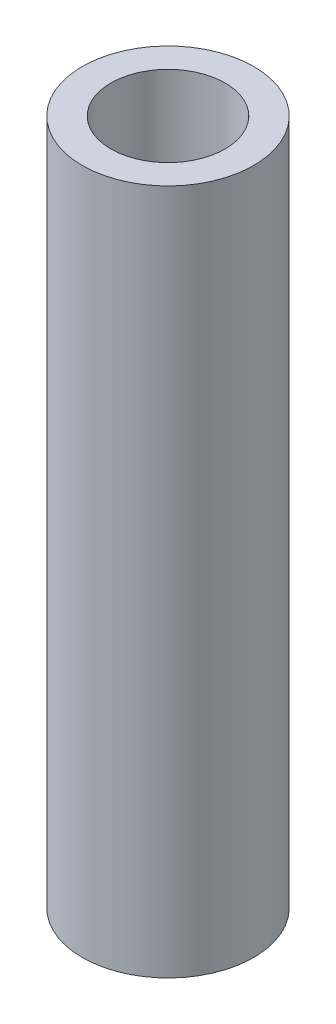
ISO-10303-21;
HEADER;
FILE_DESCRIPTION(('STEP AP214'),'2;1');
FILE_NAME('part.step','',(''),(''),'','','');
FILE_SCHEMA(('AUTOMOTIVE_DESIGN { 1 0 10303 214 1 1 1 1 }'));
ENDSEC;
DATA;
#1=APPLICATION_CONTEXT('core data for automotive mechanical design processes');
#2=APPLICATION_PROTOCOL_DEFINITION('international standard','automotive_design',2000,#1);
#3=PRODUCT_CONTEXT('',#1,'mechanical');
#4=PRODUCT('Part','Part','',(#3));
#5=PRODUCT_RELATED_PRODUCT_CATEGORY('part','',(#4));
#6=PRODUCT_DEFINITION_FORMATION('','',#4);
#7=PRODUCT_DEFINITION_CONTEXT('part definition',#1,'design');
#8=PRODUCT_DEFINITION('design','',#6,#7);
#9=PRODUCT_DEFINITION_SHAPE('','',#8);
#10=(LENGTH_UNIT() NAMED_UNIT(*) SI_UNIT(.MILLI.,.METRE.));
#11=(NAMED_UNIT(*) PLANE_ANGLE_UNIT() SI_UNIT($,.RADIAN.));
#12=(NAMED_UNIT(*) SI_UNIT($,.STERADIAN.) SOLID_ANGLE_UNIT());
#13=UNCERTAINTY_MEASURE_WITH_UNIT(LENGTH_MEASURE(1.E-05),#10,'distance_accuracy_value','');
#14=(GEOMETRIC_REPRESENTATION_CONTEXT(3) GLOBAL_UNCERTAINTY_ASSIGNED_CONTEXT((#13)) GLOBAL_UNIT_ASSIGNED_CONTEXT((#10,
#11,#12)) REPRESENTATION_CONTEXT('',''));
#15=CARTESIAN_POINT('',(0.,0.,0.));
#16=DIRECTION('',(0.,0.,1.));
#17=DIRECTION('',(1.,0.,0.));
#18=AXIS2_PLACEMENT_3D('',#15,#16,#17);
#19=CARTESIAN_POINT('',(0.,45.72,0.));
#20=DIRECTION('',(0.,1.,0.));
#21=DIRECTION('',(0.,0.,1.));
#22=AXIS2_PLACEMENT_3D('',#19,#20,#21);
#23=PLANE('',#22);
#24=CARTESIAN_POINT('',(0.,45.72,0.));
#25=DIRECTION('',(0.,1.,0.));
#26=DIRECTION('',(0.,0.,1.));
#27=AXIS2_PLACEMENT_3D('',#24,#25,#26);
#28=CIRCLE('',#27,5.715);
#29=CARTESIAN_POINT('',(0.,45.72,5.715));
#30=VERTEX_POINT('',#29);
#31=EDGE_CURVE('E10',#30,#30,#28,.T.);
#32=ORIENTED_EDGE('',*,*,#31,.T.);
#33=EDGE_LOOP('',(#32));
#34=FACE_BOUND('',#33,.T.);
#35=CARTESIAN_POINT('',(0.,45.72,0.));
#36=DIRECTION('',(0.,1.,0.));
#37=DIRECTION('',(0.,0.,1.));
#38=AXIS2_PLACEMENT_3D('',#35,#36,#37);
#39=CIRCLE('',#38,3.81);
#40=CARTESIAN_POINT('',(0.,45.72,3.81));
#41=VERTEX_POINT('',#40);
#42=EDGE_CURVE('E54',#41,#41,#39,.T.);
#43=ORIENTED_EDGE('',*,*,#42,.F.);
#44=EDGE_LOOP('',(#43));
#45=FACE_BOUND('',#44,.T.);
#46=ADVANCED_FACE('F41',(#34,#45),#23,.T.);
#47=CARTESIAN_POINT('',(0.,0.,0.));
#48=DIRECTION('',(0.,1.,0.));
#49=DIRECTION('',(0.,0.,1.));
#50=AXIS2_PLACEMENT_3D('',#47,#48,#49);
#51=PLANE('',#50);
#52=CARTESIAN_POINT('',(0.,0.,0.));
#53=DIRECTION('',(0.,1.,0.));
#54=DIRECTION('',(0.,0.,1.));
#55=AXIS2_PLACEMENT_3D('',#52,#53,#54);
#56=CIRCLE('',#55,5.715);
#57=CARTESIAN_POINT('',(0.,0.,5.715));
#58=VERTEX_POINT('',#57);
#59=EDGE_CURVE('E45',#58,#58,#56,.T.);
#60=ORIENTED_EDGE('',*,*,#59,.F.);
#61=EDGE_LOOP('',(#60));
#62=FACE_BOUND('',#61,.T.);
#63=CARTESIAN_POINT('',(0.,0.,0.));
#64=DIRECTION('',(0.,1.,0.));
#65=DIRECTION('',(0.,0.,1.));
#66=AXIS2_PLACEMENT_3D('',#63,#64,#65);
#67=CIRCLE('',#66,3.81);
#68=CARTESIAN_POINT('',(0.,0.,3.81));
#69=VERTEX_POINT('',#68);
#70=EDGE_CURVE('E56',#69,#69,#67,.T.);
#71=ORIENTED_EDGE('',*,*,#70,.T.);
#72=EDGE_LOOP('',(#71));
#73=FACE_BOUND('',#72,.T.);
#74=ADVANCED_FACE('F68',(#62,#73),#51,.F.);
#75=CARTESIAN_POINT('',(0.,45.72,0.));
#76=DIRECTION('',(0.,-1.,0.));
#77=DIRECTION('',(0.,0.,-1.));
#78=AXIS2_PLACEMENT_3D('',#75,#76,#77);
#79=CYLINDRICAL_SURFACE('',#78,5.715);
#80=ORIENTED_EDGE('',*,*,#31,.F.);
#81=EDGE_LOOP('',(#80));
#82=FACE_BOUND('',#81,.T.);
#83=ORIENTED_EDGE('',*,*,#59,.T.);
#84=EDGE_LOOP('',(#83));
#85=FACE_BOUND('',#84,.T.);
#86=ADVANCED_FACE('F43',(#82,#85),#79,.T.);
#87=CARTESIAN_POINT('',(0.,45.72,0.));
#88=DIRECTION('',(0.,-1.,0.));
#89=DIRECTION('',(0.,0.,-1.));
#90=AXIS2_PLACEMENT_3D('',#87,#88,#89);
#91=CYLINDRICAL_SURFACE('',#90,3.81);
#92=ORIENTED_EDGE('',*,*,#42,.T.);
#93=EDGE_LOOP('',(#92));
#94=FACE_BOUND('',#93,.T.);
#95=ORIENTED_EDGE('',*,*,#70,.F.);
#96=EDGE_LOOP('',(#95));
#97=FACE_BOUND('',#96,.T.);
#98=ADVANCED_FACE('F64',(#94,#97),#91,.F.);
#99=CLOSED_SHELL('',(#46,#74,#86,#98));
#100=MANIFOLD_SOLID_BREP('B2',#99);
#101=ADVANCED_BREP_SHAPE_REPRESENTATION('',(#18,#100),#14);
#102=SHAPE_DEFINITION_REPRESENTATION(#9,#101);
ENDSEC;
END-ISO-10303-21;
